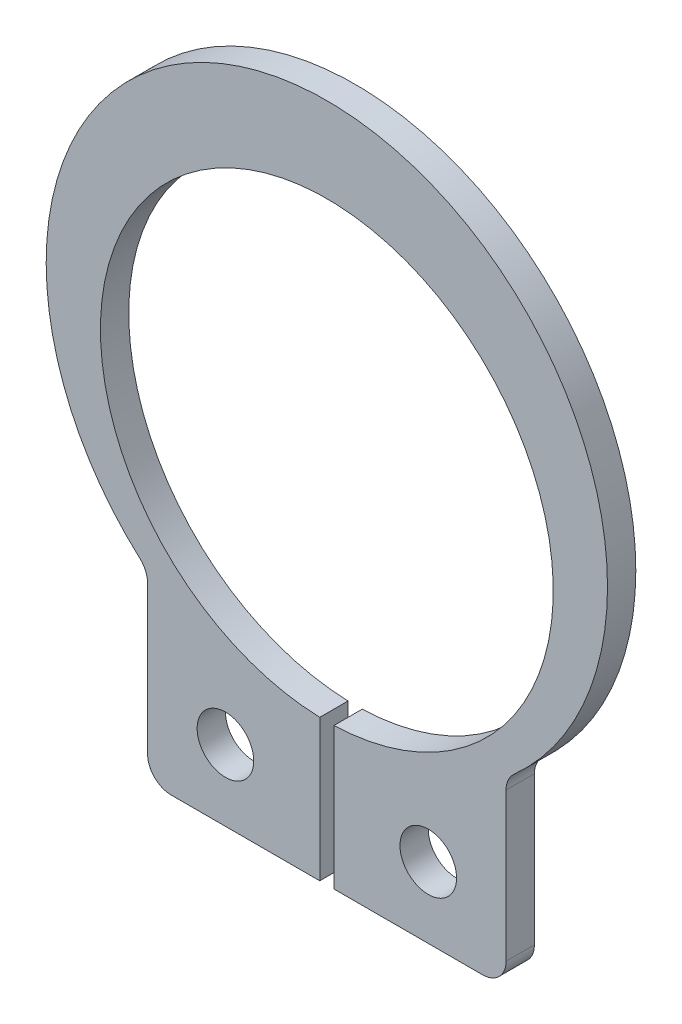
ISO-10303-21;
HEADER;
FILE_DESCRIPTION(('STEP AP214'),'2;1');
FILE_NAME('part.step','',(''),(''),'','','');
FILE_SCHEMA(('AUTOMOTIVE_DESIGN { 1 0 10303 214 1 1 1 1 }'));
ENDSEC;
DATA;
#1=APPLICATION_CONTEXT('core data for automotive mechanical design processes');
#2=APPLICATION_PROTOCOL_DEFINITION('international standard','automotive_design',2000,#1);
#3=PRODUCT_CONTEXT('',#1,'mechanical');
#4=PRODUCT('Part','Part','',(#3));
#5=PRODUCT_RELATED_PRODUCT_CATEGORY('part','',(#4));
#6=PRODUCT_DEFINITION_FORMATION('','',#4);
#7=PRODUCT_DEFINITION_CONTEXT('part definition',#1,'design');
#8=PRODUCT_DEFINITION('design','',#6,#7);
#9=PRODUCT_DEFINITION_SHAPE('','',#8);
#10=(LENGTH_UNIT() NAMED_UNIT(*) SI_UNIT(.MILLI.,.METRE.));
#11=(NAMED_UNIT(*) PLANE_ANGLE_UNIT() SI_UNIT($,.RADIAN.));
#12=(NAMED_UNIT(*) SI_UNIT($,.STERADIAN.) SOLID_ANGLE_UNIT());
#13=UNCERTAINTY_MEASURE_WITH_UNIT(LENGTH_MEASURE(1.E-05),#10,'distance_accuracy_value','');
#14=(GEOMETRIC_REPRESENTATION_CONTEXT(3) GLOBAL_UNCERTAINTY_ASSIGNED_CONTEXT((#13)) GLOBAL_UNIT_ASSIGNED_CONTEXT((#10,
#11,#12)) REPRESENTATION_CONTEXT('',''));
#15=CARTESIAN_POINT('',(0.,0.,0.));
#16=DIRECTION('',(0.,0.,1.));
#17=DIRECTION('',(1.,0.,0.));
#18=AXIS2_PLACEMENT_3D('',#15,#16,#17);
#19=CARTESIAN_POINT('',(4.3,-4.15754615162455,-0.6));
#20=DIRECTION('',(0.,0.,1.));
#21=DIRECTION('',(1.,0.,0.));
#22=AXIS2_PLACEMENT_3D('',#19,#20,#21);
#23=CYLINDRICAL_SURFACE('',#22,0.5);
#24=CARTESIAN_POINT('',(4.3,-4.15754615162455,0.));
#25=DIRECTION('',(0.,0.,-1.));
#26=DIRECTION('',(-1.,0.,0.));
#27=AXIS2_PLACEMENT_3D('',#24,#25,#26);
#28=CIRCLE('',#27,0.5);
#29=CARTESIAN_POINT('',(3.8,-4.15754615162455,0.));
#30=VERTEX_POINT('',#29);
#31=CARTESIAN_POINT('',(3.96666666666667,-3.78486815537458,0.));
#32=VERTEX_POINT('',#31);
#33=EDGE_CURVE('E153',#30,#32,#28,.T.);
#34=ORIENTED_EDGE('',*,*,#33,.F.);
#35=DIRECTION('',(0.,0.,1.));
#36=VECTOR('',#35,1.);
#37=CARTESIAN_POINT('',(3.8,-4.15754615162455,-0.6));
#38=LINE('',#37,#36);
#39=CARTESIAN_POINT('',(3.8,-4.15754615162455,-0.6));
#40=VERTEX_POINT('',#39);
#41=EDGE_CURVE('E11',#40,#30,#38,.T.);
#42=ORIENTED_EDGE('',*,*,#41,.F.);
#43=CARTESIAN_POINT('',(4.3,-4.15754615162455,-0.6));
#44=DIRECTION('',(0.,0.,-1.));
#45=DIRECTION('',(-1.,0.,0.));
#46=AXIS2_PLACEMENT_3D('',#43,#44,#45);
#47=CIRCLE('',#46,0.5);
#48=CARTESIAN_POINT('',(3.96666666666667,-3.78486815537458,-0.6));
#49=VERTEX_POINT('',#48);
#50=EDGE_CURVE('E186',#40,#49,#47,.T.);
#51=ORIENTED_EDGE('',*,*,#50,.T.);
#52=DIRECTION('',(0.,0.,1.));
#53=VECTOR('',#52,1.);
#54=CARTESIAN_POINT('',(3.96666666666667,-3.78486815537458,-0.6));
#55=LINE('',#54,#53);
#56=EDGE_CURVE('E35',#49,#32,#55,.T.);
#57=ORIENTED_EDGE('',*,*,#56,.T.);
#58=EDGE_LOOP('',(#34,#42,#51,#57));
#59=FACE_BOUND('',#58,.T.);
#60=ADVANCED_FACE('F32',(#59),#23,.F.);
#61=CARTESIAN_POINT('',(3.8,-7.3,-0.6));
#62=DIRECTION('',(1.,0.,0.));
#63=DIRECTION('',(0.,0.,-1.));
#64=AXIS2_PLACEMENT_3D('',#61,#62,#63);
#65=PLANE('',#64);
#66=DIRECTION('',(0.,1.,0.));
#67=VECTOR('',#66,1.);
#68=CARTESIAN_POINT('',(3.8,-7.3,0.));
#69=LINE('',#68,#67);
#70=CARTESIAN_POINT('',(3.8,-7.3,0.));
#71=VERTEX_POINT('',#70);
#72=EDGE_CURVE('E184',#71,#30,#69,.T.);
#73=ORIENTED_EDGE('',*,*,#72,.F.);
#74=DIRECTION('',(0.,0.,1.));
#75=VECTOR('',#74,1.);
#76=CARTESIAN_POINT('',(3.8,-7.3,-0.6));
#77=LINE('',#76,#75);
#78=CARTESIAN_POINT('',(3.8,-7.3,-0.6));
#79=VERTEX_POINT('',#78);
#80=EDGE_CURVE('E41',#79,#71,#77,.T.);
#81=ORIENTED_EDGE('',*,*,#80,.F.);
#82=DIRECTION('',(0.,1.,0.));
#83=VECTOR('',#82,1.);
#84=CARTESIAN_POINT('',(3.8,-7.3,-0.6));
#85=LINE('',#84,#83);
#86=EDGE_CURVE('E143',#79,#40,#85,.T.);
#87=ORIENTED_EDGE('',*,*,#86,.T.);
#88=ORIENTED_EDGE('',*,*,#41,.T.);
#89=EDGE_LOOP('',(#73,#81,#87,#88));
#90=FACE_BOUND('',#89,.T.);
#91=ADVANCED_FACE('F206',(#90),#65,.T.);
#92=CARTESIAN_POINT('',(3.3,-7.3,-0.6));
#93=DIRECTION('',(0.,0.,1.));
#94=DIRECTION('',(1.,0.,0.));
#95=AXIS2_PLACEMENT_3D('',#92,#93,#94);
#96=CYLINDRICAL_SURFACE('',#95,0.5);
#97=CARTESIAN_POINT('',(3.3,-7.3,0.));
#98=DIRECTION('',(0.,0.,1.));
#99=DIRECTION('',(1.,0.,0.));
#100=AXIS2_PLACEMENT_3D('',#97,#98,#99);
#101=CIRCLE('',#100,0.5);
#102=CARTESIAN_POINT('',(3.3,-7.8,0.));
#103=VERTEX_POINT('',#102);
#104=EDGE_CURVE('E130',#103,#71,#101,.T.);
#105=ORIENTED_EDGE('',*,*,#104,.F.);
#106=DIRECTION('',(0.,0.,1.));
#107=VECTOR('',#106,1.);
#108=CARTESIAN_POINT('',(3.3,-7.8,-0.6));
#109=LINE('',#108,#107);
#110=CARTESIAN_POINT('',(3.3,-7.8,-0.6));
#111=VERTEX_POINT('',#110);
#112=EDGE_CURVE('E125',#111,#103,#109,.T.);
#113=ORIENTED_EDGE('',*,*,#112,.F.);
#114=CARTESIAN_POINT('',(3.3,-7.3,-0.6));
#115=DIRECTION('',(0.,0.,1.));
#116=DIRECTION('',(1.,0.,0.));
#117=AXIS2_PLACEMENT_3D('',#114,#115,#116);
#118=CIRCLE('',#117,0.5);
#119=EDGE_CURVE('E128',#111,#79,#118,.T.);
#120=ORIENTED_EDGE('',*,*,#119,.T.);
#121=ORIENTED_EDGE('',*,*,#80,.T.);
#122=EDGE_LOOP('',(#105,#113,#120,#121));
#123=FACE_BOUND('',#122,.T.);
#124=ADVANCED_FACE('F127',(#123),#96,.T.);
#125=CARTESIAN_POINT('',(0.15,-7.8,-0.6));
#126=DIRECTION('',(0.,-1.,0.));
#127=DIRECTION('',(0.,0.,-1.));
#128=AXIS2_PLACEMENT_3D('',#125,#126,#127);
#129=PLANE('',#128);
#130=DIRECTION('',(1.,0.,0.));
#131=VECTOR('',#130,1.);
#132=CARTESIAN_POINT('',(0.15,-7.8,0.));
#133=LINE('',#132,#131);
#134=CARTESIAN_POINT('',(0.15,-7.8,0.));
#135=VERTEX_POINT('',#134);
#136=EDGE_CURVE('E181',#135,#103,#133,.T.);
#137=ORIENTED_EDGE('',*,*,#136,.F.);
#138=DIRECTION('',(0.,0.,1.));
#139=VECTOR('',#138,1.);
#140=CARTESIAN_POINT('',(0.15,-7.8,-0.6));
#141=LINE('',#140,#139);
#142=CARTESIAN_POINT('',(0.15,-7.8,-0.6));
#143=VERTEX_POINT('',#142);
#144=EDGE_CURVE('E135',#143,#135,#141,.T.);
#145=ORIENTED_EDGE('',*,*,#144,.F.);
#146=DIRECTION('',(1.,0.,0.));
#147=VECTOR('',#146,1.);
#148=CARTESIAN_POINT('',(0.15,-7.8,-0.6));
#149=LINE('',#148,#147);
#150=EDGE_CURVE('E141',#143,#111,#149,.T.);
#151=ORIENTED_EDGE('',*,*,#150,.T.);
#152=ORIENTED_EDGE('',*,*,#112,.T.);
#153=EDGE_LOOP('',(#137,#145,#151,#152));
#154=FACE_BOUND('',#153,.T.);
#155=ADVANCED_FACE('F145',(#154),#129,.T.);
#156=CARTESIAN_POINT('',(0.15,-4.79765567751584,-0.6));
#157=DIRECTION('',(-1.,0.,0.));
#158=DIRECTION('',(0.,-1.,0.));
#159=AXIS2_PLACEMENT_3D('',#156,#157,#158);
#160=PLANE('',#159);
#161=DIRECTION('',(0.,-1.,0.));
#162=VECTOR('',#161,1.);
#163=CARTESIAN_POINT('',(0.15,-4.79765567751584,0.));
#164=LINE('',#163,#162);
#165=CARTESIAN_POINT('',(0.150000000000003,-4.79765567751584,0.));
#166=VERTEX_POINT('',#165);
#167=EDGE_CURVE('E178',#166,#135,#164,.T.);
#168=ORIENTED_EDGE('',*,*,#167,.F.);
#169=DIRECTION('',(0.,0.,1.));
#170=VECTOR('',#169,1.);
#171=CARTESIAN_POINT('',(0.150000000000003,-4.79765567751584,-0.6));
#172=LINE('',#171,#170);
#173=CARTESIAN_POINT('',(0.150000000000003,-4.79765567751584,-0.6));
#174=VERTEX_POINT('',#173);
#175=EDGE_CURVE('E190',#174,#166,#172,.T.);
#176=ORIENTED_EDGE('',*,*,#175,.F.);
#177=DIRECTION('',(0.,-1.,0.));
#178=VECTOR('',#177,1.);
#179=CARTESIAN_POINT('',(0.15,-4.79765567751584,-0.6));
#180=LINE('',#179,#178);
#181=EDGE_CURVE('E146',#174,#143,#180,.T.);
#182=ORIENTED_EDGE('',*,*,#181,.T.);
#183=ORIENTED_EDGE('',*,*,#144,.T.);
#184=EDGE_LOOP('',(#168,#176,#182,#183));
#185=FACE_BOUND('',#184,.T.);
#186=ADVANCED_FACE('F219',(#185),#160,.T.);
#187=CARTESIAN_POINT('',(0.,0.,-0.6));
#188=DIRECTION('',(0.,0.,1.));
#189=DIRECTION('',(1.,0.,0.));
#190=AXIS2_PLACEMENT_3D('',#187,#188,#189);
#191=CYLINDRICAL_SURFACE('',#190,4.80000000000002);
#192=CARTESIAN_POINT('',(0.,0.,0.));
#193=DIRECTION('',(0.,0.,-1.));
#194=DIRECTION('',(-1.,0.,0.));
#195=AXIS2_PLACEMENT_3D('',#192,#193,#194);
#196=CIRCLE('',#195,4.80000000000002);
#197=CARTESIAN_POINT('',(-0.15,-4.79765567751584,0.));
#198=VERTEX_POINT('',#197);
#199=EDGE_CURVE('E175',#198,#166,#196,.T.);
#200=ORIENTED_EDGE('',*,*,#199,.F.);
#201=DIRECTION('',(0.,0.,1.));
#202=VECTOR('',#201,1.);
#203=CARTESIAN_POINT('',(-0.15,-4.79765567751584,-0.6));
#204=LINE('',#203,#202);
#205=CARTESIAN_POINT('',(-0.15,-4.79765567751584,-0.6));
#206=VERTEX_POINT('',#205);
#207=EDGE_CURVE('E192',#206,#198,#204,.T.);
#208=ORIENTED_EDGE('',*,*,#207,.F.);
#209=CARTESIAN_POINT('',(0.,0.,-0.6));
#210=DIRECTION('',(0.,0.,-1.));
#211=DIRECTION('',(-1.,0.,0.));
#212=AXIS2_PLACEMENT_3D('',#209,#210,#211);
#213=CIRCLE('',#212,4.80000000000002);
#214=EDGE_CURVE('E148',#206,#174,#213,.T.);
#215=ORIENTED_EDGE('',*,*,#214,.T.);
#216=ORIENTED_EDGE('',*,*,#175,.T.);
#217=EDGE_LOOP('',(#200,#208,#215,#216));
#218=FACE_BOUND('',#217,.T.);
#219=ADVANCED_FACE('F222',(#218),#191,.F.);
#220=CARTESIAN_POINT('',(-0.15,-7.8,-0.6));
#221=DIRECTION('',(1.,0.,0.));
#222=DIRECTION('',(0.,1.,0.));
#223=AXIS2_PLACEMENT_3D('',#220,#221,#222);
#224=PLANE('',#223);
#225=DIRECTION('',(0.,1.,0.));
#226=VECTOR('',#225,1.);
#227=CARTESIAN_POINT('',(-0.15,-7.8,0.));
#228=LINE('',#227,#226);
#229=CARTESIAN_POINT('',(-0.15,-7.8,0.));
#230=VERTEX_POINT('',#229);
#231=EDGE_CURVE('E172',#230,#198,#228,.T.);
#232=ORIENTED_EDGE('',*,*,#231,.F.);
#233=DIRECTION('',(0.,0.,1.));
#234=VECTOR('',#233,1.);
#235=CARTESIAN_POINT('',(-0.15,-7.8,-0.6));
#236=LINE('',#235,#234);
#237=CARTESIAN_POINT('',(-0.15,-7.8,-0.6));
#238=VERTEX_POINT('',#237);
#239=EDGE_CURVE('E194',#238,#230,#236,.T.);
#240=ORIENTED_EDGE('',*,*,#239,.F.);
#241=DIRECTION('',(0.,1.,0.));
#242=VECTOR('',#241,1.);
#243=CARTESIAN_POINT('',(-0.15,-7.8,-0.6));
#244=LINE('',#243,#242);
#245=EDGE_CURVE('E296',#238,#206,#244,.T.);
#246=ORIENTED_EDGE('',*,*,#245,.T.);
#247=ORIENTED_EDGE('',*,*,#207,.T.);
#248=EDGE_LOOP('',(#232,#240,#246,#247));
#249=FACE_BOUND('',#248,.T.);
#250=ADVANCED_FACE('F226',(#249),#224,.T.);
#251=CARTESIAN_POINT('',(-3.3,-7.8,-0.6));
#252=DIRECTION('',(0.,-1.,0.));
#253=DIRECTION('',(0.,0.,-1.));
#254=AXIS2_PLACEMENT_3D('',#251,#252,#253);
#255=PLANE('',#254);
#256=DIRECTION('',(1.,0.,0.));
#257=VECTOR('',#256,1.);
#258=CARTESIAN_POINT('',(-3.3,-7.8,0.));
#259=LINE('',#258,#257);
#260=CARTESIAN_POINT('',(-3.3,-7.8,0.));
#261=VERTEX_POINT('',#260);
#262=EDGE_CURVE('E169',#261,#230,#259,.T.);
#263=ORIENTED_EDGE('',*,*,#262,.F.);
#264=DIRECTION('',(0.,0.,1.));
#265=VECTOR('',#264,1.);
#266=CARTESIAN_POINT('',(-3.3,-7.8,-0.6));
#267=LINE('',#266,#265);
#268=CARTESIAN_POINT('',(-3.3,-7.8,-0.6));
#269=VERTEX_POINT('',#268);
#270=EDGE_CURVE('E196',#269,#261,#267,.T.);
#271=ORIENTED_EDGE('',*,*,#270,.F.);
#272=DIRECTION('',(1.,0.,0.));
#273=VECTOR('',#272,1.);
#274=CARTESIAN_POINT('',(-3.3,-7.8,-0.6));
#275=LINE('',#274,#273);
#276=EDGE_CURVE('E293',#269,#238,#275,.T.);
#277=ORIENTED_EDGE('',*,*,#276,.T.);
#278=ORIENTED_EDGE('',*,*,#239,.T.);
#279=EDGE_LOOP('',(#263,#271,#277,#278));
#280=FACE_BOUND('',#279,.T.);
#281=ADVANCED_FACE('F230',(#280),#255,.T.);
#282=CARTESIAN_POINT('',(-3.3,-7.3,-0.6));
#283=DIRECTION('',(0.,0.,1.));
#284=DIRECTION('',(1.,0.,0.));
#285=AXIS2_PLACEMENT_3D('',#282,#283,#284);
#286=CYLINDRICAL_SURFACE('',#285,0.5);
#287=CARTESIAN_POINT('',(-3.3,-7.3,0.));
#288=DIRECTION('',(0.,0.,1.));
#289=DIRECTION('',(1.,0.,0.));
#290=AXIS2_PLACEMENT_3D('',#287,#288,#289);
#291=CIRCLE('',#290,0.5);
#292=CARTESIAN_POINT('',(-3.8,-7.3,0.));
#293=VERTEX_POINT('',#292);
#294=EDGE_CURVE('E166',#293,#261,#291,.T.);
#295=ORIENTED_EDGE('',*,*,#294,.F.);
#296=DIRECTION('',(0.,0.,1.));
#297=VECTOR('',#296,1.);
#298=CARTESIAN_POINT('',(-3.8,-7.3,-0.6));
#299=LINE('',#298,#297);
#300=CARTESIAN_POINT('',(-3.8,-7.3,-0.6));
#301=VERTEX_POINT('',#300);
#302=EDGE_CURVE('E198',#301,#293,#299,.T.);
#303=ORIENTED_EDGE('',*,*,#302,.F.);
#304=CARTESIAN_POINT('',(-3.3,-7.3,-0.6));
#305=DIRECTION('',(0.,0.,1.));
#306=DIRECTION('',(1.,0.,0.));
#307=AXIS2_PLACEMENT_3D('',#304,#305,#306);
#308=CIRCLE('',#307,0.5);
#309=EDGE_CURVE('E290',#301,#269,#308,.T.);
#310=ORIENTED_EDGE('',*,*,#309,.T.);
#311=ORIENTED_EDGE('',*,*,#270,.T.);
#312=EDGE_LOOP('',(#295,#303,#310,#311));
#313=FACE_BOUND('',#312,.T.);
#314=ADVANCED_FACE('F234',(#313),#286,.T.);
#315=CARTESIAN_POINT('',(-3.8,-4.15754615162455,-0.6));
#316=DIRECTION('',(-1.,0.,0.));
#317=DIRECTION('',(0.,0.,1.));
#318=AXIS2_PLACEMENT_3D('',#315,#316,#317);
#319=PLANE('',#318);
#320=DIRECTION('',(0.,-1.,0.));
#321=VECTOR('',#320,1.);
#322=CARTESIAN_POINT('',(-3.8,-4.15754615162455,0.));
#323=LINE('',#322,#321);
#324=CARTESIAN_POINT('',(-3.8,-4.15754615162455,0.));
#325=VERTEX_POINT('',#324);
#326=EDGE_CURVE('E163',#325,#293,#323,.T.);
#327=ORIENTED_EDGE('',*,*,#326,.F.);
#328=DIRECTION('',(0.,0.,1.));
#329=VECTOR('',#328,1.);
#330=CARTESIAN_POINT('',(-3.8,-4.15754615162455,-0.6));
#331=LINE('',#330,#329);
#332=CARTESIAN_POINT('',(-3.8,-4.15754615162455,-0.6));
#333=VERTEX_POINT('',#332);
#334=EDGE_CURVE('E200',#333,#325,#331,.T.);
#335=ORIENTED_EDGE('',*,*,#334,.F.);
#336=DIRECTION('',(0.,-1.,0.));
#337=VECTOR('',#336,1.);
#338=CARTESIAN_POINT('',(-3.8,-4.15754615162455,-0.6));
#339=LINE('',#338,#337);
#340=EDGE_CURVE('E287',#333,#301,#339,.T.);
#341=ORIENTED_EDGE('',*,*,#340,.T.);
#342=ORIENTED_EDGE('',*,*,#302,.T.);
#343=EDGE_LOOP('',(#327,#335,#341,#342));
#344=FACE_BOUND('',#343,.T.);
#345=ADVANCED_FACE('F238',(#344),#319,.T.);
#346=CARTESIAN_POINT('',(-4.3,-4.15754615162455,-0.6));
#347=DIRECTION('',(0.,0.,1.));
#348=DIRECTION('',(1.,0.,0.));
#349=AXIS2_PLACEMENT_3D('',#346,#347,#348);
#350=CYLINDRICAL_SURFACE('',#349,0.5);
#351=CARTESIAN_POINT('',(-4.3,-4.15754615162455,0.));
#352=DIRECTION('',(0.,0.,-1.));
#353=DIRECTION('',(-1.,0.,0.));
#354=AXIS2_PLACEMENT_3D('',#351,#352,#353);
#355=CIRCLE('',#354,0.5);
#356=CARTESIAN_POINT('',(-3.96666666666667,-3.78486815537458,0.));
#357=VERTEX_POINT('',#356);
#358=EDGE_CURVE('E160',#357,#325,#355,.T.);
#359=ORIENTED_EDGE('',*,*,#358,.F.);
#360=DIRECTION('',(0.,0.,1.));
#361=VECTOR('',#360,1.);
#362=CARTESIAN_POINT('',(-3.96666666666667,-3.78486815537458,-0.6));
#363=LINE('',#362,#361);
#364=CARTESIAN_POINT('',(-3.96666666666667,-3.78486815537458,-0.6));
#365=VERTEX_POINT('',#364);
#366=EDGE_CURVE('E201',#365,#357,#363,.T.);
#367=ORIENTED_EDGE('',*,*,#366,.F.);
#368=CARTESIAN_POINT('',(-4.3,-4.15754615162455,-0.6));
#369=DIRECTION('',(0.,0.,-1.));
#370=DIRECTION('',(-1.,0.,0.));
#371=AXIS2_PLACEMENT_3D('',#368,#369,#370);
#372=CIRCLE('',#371,0.5);
#373=EDGE_CURVE('E284',#365,#333,#372,.T.);
#374=ORIENTED_EDGE('',*,*,#373,.T.);
#375=ORIENTED_EDGE('',*,*,#334,.T.);
#376=EDGE_LOOP('',(#359,#367,#374,#375));
#377=FACE_BOUND('',#376,.T.);
#378=ADVANCED_FACE('F242',(#377),#350,.F.);
#379=CARTESIAN_POINT('',(0.,0.65,-0.6));
#380=DIRECTION('',(0.,0.,1.));
#381=DIRECTION('',(1.,0.,0.));
#382=AXIS2_PLACEMENT_3D('',#379,#380,#381);
#383=CYLINDRICAL_SURFACE('',#382,5.95);
#384=CARTESIAN_POINT('',(0.,0.65,0.));
#385=DIRECTION('',(0.,0.,1.));
#386=DIRECTION('',(1.,0.,0.));
#387=AXIS2_PLACEMENT_3D('',#384,#385,#386);
#388=CIRCLE('',#387,5.95);
#389=EDGE_CURVE('E156',#32,#357,#388,.T.);
#390=ORIENTED_EDGE('',*,*,#389,.F.);
#391=ORIENTED_EDGE('',*,*,#56,.F.);
#392=CARTESIAN_POINT('',(0.,0.65,-0.6));
#393=DIRECTION('',(0.,0.,1.));
#394=DIRECTION('',(1.,0.,0.));
#395=AXIS2_PLACEMENT_3D('',#392,#393,#394);
#396=CIRCLE('',#395,5.95);
#397=EDGE_CURVE('E282',#49,#365,#396,.T.);
#398=ORIENTED_EDGE('',*,*,#397,.T.);
#399=ORIENTED_EDGE('',*,*,#366,.T.);
#400=EDGE_LOOP('',(#390,#391,#398,#399));
#401=FACE_BOUND('',#400,.T.);
#402=ADVANCED_FACE('F203',(#401),#383,.T.);
#403=CARTESIAN_POINT('',(4.3,-4.15754615162455,-0.6));
#404=DIRECTION('',(0.,0.,-1.));
#405=DIRECTION('',(-1.,0.,0.));
#406=AXIS2_PLACEMENT_3D('',#403,#404,#405);
#407=PLANE('',#406);
#408=CARTESIAN_POINT('',(2.15,-6.3,-0.6));
#409=DIRECTION('',(0.,0.,1.));
#410=DIRECTION('',(1.,0.,0.));
#411=AXIS2_PLACEMENT_3D('',#408,#409,#410);
#412=CIRCLE('',#411,0.6);
#413=CARTESIAN_POINT('',(2.75,-6.3,-0.6));
#414=VERTEX_POINT('',#413);
#415=EDGE_CURVE('E269',#414,#414,#412,.T.);
#416=ORIENTED_EDGE('',*,*,#415,.T.);
#417=EDGE_LOOP('',(#416));
#418=FACE_BOUND('',#417,.T.);
#419=CARTESIAN_POINT('',(-2.15,-6.3,-0.6));
#420=DIRECTION('',(0.,0.,1.));
#421=DIRECTION('',(1.,0.,0.));
#422=AXIS2_PLACEMENT_3D('',#419,#420,#421);
#423=CIRCLE('',#422,0.6);
#424=CARTESIAN_POINT('',(-1.55,-6.3,-0.6));
#425=VERTEX_POINT('',#424);
#426=EDGE_CURVE('E157',#425,#425,#423,.T.);
#427=ORIENTED_EDGE('',*,*,#426,.T.);
#428=EDGE_LOOP('',(#427));
#429=FACE_BOUND('',#428,.T.);
#430=ORIENTED_EDGE('',*,*,#50,.F.);
#431=ORIENTED_EDGE('',*,*,#86,.F.);
#432=ORIENTED_EDGE('',*,*,#119,.F.);
#433=ORIENTED_EDGE('',*,*,#150,.F.);
#434=ORIENTED_EDGE('',*,*,#181,.F.);
#435=ORIENTED_EDGE('',*,*,#214,.F.);
#436=ORIENTED_EDGE('',*,*,#245,.F.);
#437=ORIENTED_EDGE('',*,*,#276,.F.);
#438=ORIENTED_EDGE('',*,*,#309,.F.);
#439=ORIENTED_EDGE('',*,*,#340,.F.);
#440=ORIENTED_EDGE('',*,*,#373,.F.);
#441=ORIENTED_EDGE('',*,*,#397,.F.);
#442=EDGE_LOOP('',(#430,#431,#432,#433,#434,#435,#436,#437,#438,#439,#440,#441));
#443=FACE_BOUND('',#442,.T.);
#444=ADVANCED_FACE('F139',(#418,#429,#443),#407,.T.);
#445=CARTESIAN_POINT('',(4.3,-4.15754615162455,0.));
#446=DIRECTION('',(0.,0.,-1.));
#447=DIRECTION('',(-1.,0.,0.));
#448=AXIS2_PLACEMENT_3D('',#445,#446,#447);
#449=PLANE('',#448);
#450=CARTESIAN_POINT('',(2.15,-6.3,0.));
#451=DIRECTION('',(0.,0.,1.));
#452=DIRECTION('',(1.,0.,0.));
#453=AXIS2_PLACEMENT_3D('',#450,#451,#452);
#454=CIRCLE('',#453,0.6);
#455=CARTESIAN_POINT('',(2.75,-6.3,0.));
#456=VERTEX_POINT('',#455);
#457=EDGE_CURVE('E272',#456,#456,#454,.T.);
#458=ORIENTED_EDGE('',*,*,#457,.F.);
#459=EDGE_LOOP('',(#458));
#460=FACE_BOUND('',#459,.T.);
#461=CARTESIAN_POINT('',(-2.15,-6.3,0.));
#462=DIRECTION('',(0.,0.,1.));
#463=DIRECTION('',(1.,0.,0.));
#464=AXIS2_PLACEMENT_3D('',#461,#462,#463);
#465=CIRCLE('',#464,0.6);
#466=CARTESIAN_POINT('',(-1.55,-6.3,0.));
#467=VERTEX_POINT('',#466);
#468=EDGE_CURVE('E274',#467,#467,#465,.T.);
#469=ORIENTED_EDGE('',*,*,#468,.F.);
#470=EDGE_LOOP('',(#469));
#471=FACE_BOUND('',#470,.T.);
#472=ORIENTED_EDGE('',*,*,#33,.T.);
#473=ORIENTED_EDGE('',*,*,#389,.T.);
#474=ORIENTED_EDGE('',*,*,#358,.T.);
#475=ORIENTED_EDGE('',*,*,#326,.T.);
#476=ORIENTED_EDGE('',*,*,#294,.T.);
#477=ORIENTED_EDGE('',*,*,#262,.T.);
#478=ORIENTED_EDGE('',*,*,#231,.T.);
#479=ORIENTED_EDGE('',*,*,#199,.T.);
#480=ORIENTED_EDGE('',*,*,#167,.T.);
#481=ORIENTED_EDGE('',*,*,#136,.T.);
#482=ORIENTED_EDGE('',*,*,#104,.T.);
#483=ORIENTED_EDGE('',*,*,#72,.T.);
#484=EDGE_LOOP('',(#472,#473,#474,#475,#476,#477,#478,#479,#480,#481,#482,#483));
#485=FACE_BOUND('',#484,.T.);
#486=ADVANCED_FACE('F205',(#460,#471,#485),#449,.F.);
#487=CARTESIAN_POINT('',(-2.15,-6.3,-0.6));
#488=DIRECTION('',(0.,0.,1.));
#489=DIRECTION('',(1.,0.,0.));
#490=AXIS2_PLACEMENT_3D('',#487,#488,#489);
#491=CYLINDRICAL_SURFACE('',#490,0.6);
#492=ORIENTED_EDGE('',*,*,#426,.F.);
#493=EDGE_LOOP('',(#492));
#494=FACE_BOUND('',#493,.T.);
#495=ORIENTED_EDGE('',*,*,#468,.T.);
#496=EDGE_LOOP('',(#495));
#497=FACE_BOUND('',#496,.T.);
#498=ADVANCED_FACE('F254',(#494,#497),#491,.F.);
#499=CARTESIAN_POINT('',(2.15,-6.3,-0.6));
#500=DIRECTION('',(0.,0.,1.));
#501=DIRECTION('',(1.,0.,0.));
#502=AXIS2_PLACEMENT_3D('',#499,#500,#501);
#503=CYLINDRICAL_SURFACE('',#502,0.6);
#504=ORIENTED_EDGE('',*,*,#415,.F.);
#505=EDGE_LOOP('',(#504));
#506=FACE_BOUND('',#505,.T.);
#507=ORIENTED_EDGE('',*,*,#457,.T.);
#508=EDGE_LOOP('',(#507));
#509=FACE_BOUND('',#508,.T.);
#510=ADVANCED_FACE('F261',(#506,#509),#503,.F.);
#511=CLOSED_SHELL('',(#60,#91,#124,#155,#186,#219,#250,#281,#314,#345,#378,#402,#444,#486,#498,#510));
#512=MANIFOLD_SOLID_BREP('B2',#511);
#513=ADVANCED_BREP_SHAPE_REPRESENTATION('',(#18,#512),#14);
#514=SHAPE_DEFINITION_REPRESENTATION(#9,#513);
ENDSEC;
END-ISO-10303-21;
